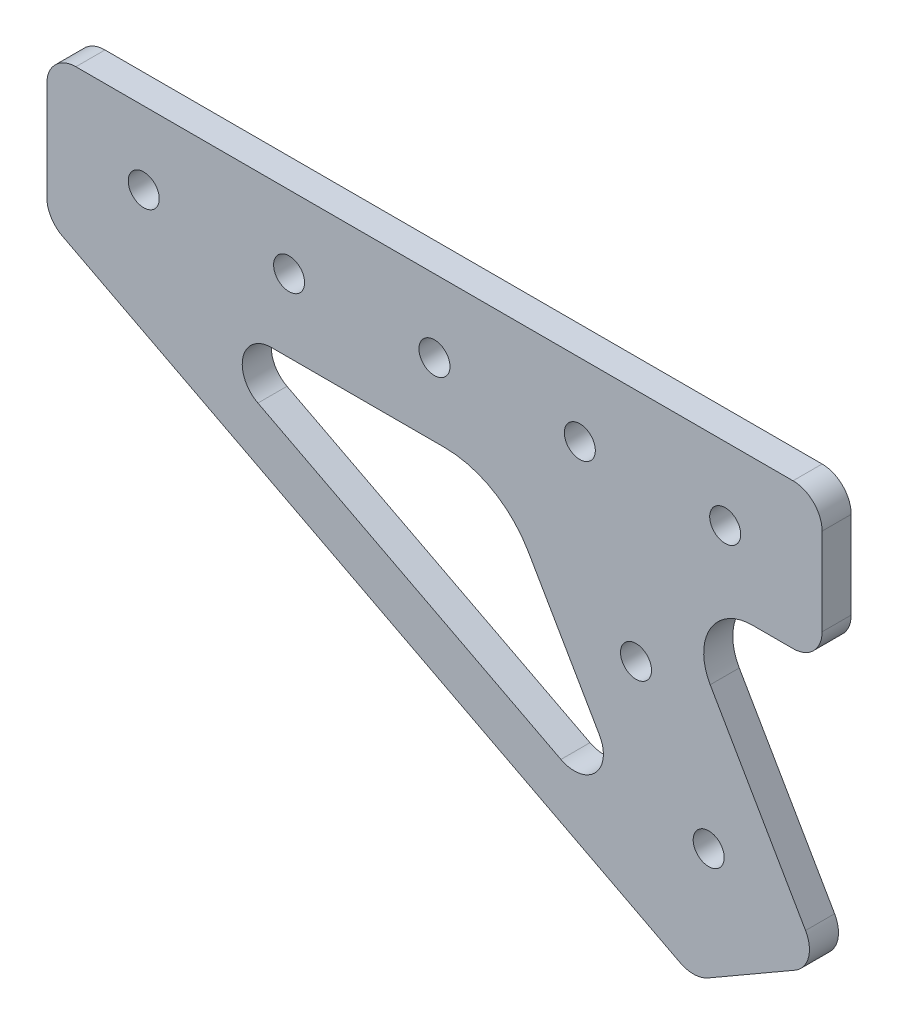
ISO-10303-21;
HEADER;
FILE_DESCRIPTION(('STEP AP214'),'2;1');
FILE_NAME('part.step','',(''),(''),'','','');
FILE_SCHEMA(('AUTOMOTIVE_DESIGN { 1 0 10303 214 1 1 1 1 }'));
ENDSEC;
DATA;
#1=APPLICATION_CONTEXT('core data for automotive mechanical design processes');
#2=APPLICATION_PROTOCOL_DEFINITION('international standard','automotive_design',2000,#1);
#3=PRODUCT_CONTEXT('',#1,'mechanical');
#4=PRODUCT('Part','Part','',(#3));
#5=PRODUCT_RELATED_PRODUCT_CATEGORY('part','',(#4));
#6=PRODUCT_DEFINITION_FORMATION('','',#4);
#7=PRODUCT_DEFINITION_CONTEXT('part definition',#1,'design');
#8=PRODUCT_DEFINITION('design','',#6,#7);
#9=PRODUCT_DEFINITION_SHAPE('','',#8);
#10=(LENGTH_UNIT() NAMED_UNIT(*) SI_UNIT(.MILLI.,.METRE.));
#11=(NAMED_UNIT(*) PLANE_ANGLE_UNIT() SI_UNIT($,.RADIAN.));
#12=(NAMED_UNIT(*) SI_UNIT($,.STERADIAN.) SOLID_ANGLE_UNIT());
#13=UNCERTAINTY_MEASURE_WITH_UNIT(LENGTH_MEASURE(1.E-05),#10,'distance_accuracy_value','');
#14=(GEOMETRIC_REPRESENTATION_CONTEXT(3) GLOBAL_UNCERTAINTY_ASSIGNED_CONTEXT((#13)) GLOBAL_UNIT_ASSIGNED_CONTEXT((#10,
#11,#12)) REPRESENTATION_CONTEXT('',''));
#15=CARTESIAN_POINT('',(0.,0.,0.));
#16=DIRECTION('',(0.,0.,1.));
#17=DIRECTION('',(1.,0.,0.));
#18=AXIS2_PLACEMENT_3D('',#15,#16,#17);
#19=CARTESIAN_POINT('',(0.,0.,3.));
#20=DIRECTION('',(0.,0.,-1.));
#21=DIRECTION('',(-1.,0.,0.));
#22=AXIS2_PLACEMENT_3D('',#19,#20,#21);
#23=PLANE('',#22);
#24=CARTESIAN_POINT('',(-11.7032905771331,-37.2307621135331,3.));
#25=DIRECTION('',(0.,0.,1.));
#26=DIRECTION('',(1.,0.,0.));
#27=AXIS2_PLACEMENT_3D('',#24,#25,#26);
#28=CIRCLE('',#27,1.6);
#29=CARTESIAN_POINT('',(-10.1032905771331,-37.2307621135331,3.));
#30=VERTEX_POINT('',#29);
#31=EDGE_CURVE('E321',#30,#30,#28,.T.);
#32=ORIENTED_EDGE('',*,*,#31,.F.);
#33=EDGE_LOOP('',(#32));
#34=FACE_BOUND('',#33,.T.);
#35=CARTESIAN_POINT('',(-19.2032905771331,-24.2403810567665,3.));
#36=DIRECTION('',(0.,0.,1.));
#37=DIRECTION('',(1.,0.,0.));
#38=AXIS2_PLACEMENT_3D('',#35,#36,#37);
#39=CIRCLE('',#38,1.6);
#40=CARTESIAN_POINT('',(-17.6032905771331,-24.2403810567665,3.));
#41=VERTEX_POINT('',#40);
#42=EDGE_CURVE('E663',#41,#41,#39,.T.);
#43=ORIENTED_EDGE('',*,*,#42,.F.);
#44=EDGE_LOOP('',(#43));
#45=FACE_BOUND('',#44,.T.);
#46=CARTESIAN_POINT('',(-9.99999999999979,-7.5,3.));
#47=DIRECTION('',(0.,0.,1.));
#48=DIRECTION('',(1.,0.,0.));
#49=AXIS2_PLACEMENT_3D('',#46,#47,#48);
#50=CIRCLE('',#49,1.6);
#51=CARTESIAN_POINT('',(-8.39999999999979,-7.5,3.));
#52=VERTEX_POINT('',#51);
#53=EDGE_CURVE('E667',#52,#52,#50,.T.);
#54=ORIENTED_EDGE('',*,*,#53,.F.);
#55=EDGE_LOOP('',(#54));
#56=FACE_BOUND('',#55,.T.);
#57=CARTESIAN_POINT('',(-24.9999999999998,-7.5,3.));
#58=DIRECTION('',(0.,0.,1.));
#59=DIRECTION('',(1.,0.,0.));
#60=AXIS2_PLACEMENT_3D('',#57,#58,#59);
#61=CIRCLE('',#60,1.6);
#62=CARTESIAN_POINT('',(-23.3999999999998,-7.5,3.));
#63=VERTEX_POINT('',#62);
#64=EDGE_CURVE('E675',#63,#63,#61,.T.);
#65=ORIENTED_EDGE('',*,*,#64,.F.);
#66=EDGE_LOOP('',(#65));
#67=FACE_BOUND('',#66,.T.);
#68=CARTESIAN_POINT('',(-39.9999999999998,-7.5,3.));
#69=DIRECTION('',(0.,0.,1.));
#70=DIRECTION('',(1.,0.,0.));
#71=AXIS2_PLACEMENT_3D('',#68,#69,#70);
#72=CIRCLE('',#71,1.6);
#73=CARTESIAN_POINT('',(-38.3999999999998,-7.5,3.));
#74=VERTEX_POINT('',#73);
#75=EDGE_CURVE('E681',#74,#74,#72,.T.);
#76=ORIENTED_EDGE('',*,*,#75,.F.);
#77=EDGE_LOOP('',(#76));
#78=FACE_BOUND('',#77,.T.);
#79=CARTESIAN_POINT('',(-54.9999999999998,-7.5,3.));
#80=DIRECTION('',(0.,0.,1.));
#81=DIRECTION('',(1.,0.,0.));
#82=AXIS2_PLACEMENT_3D('',#79,#80,#81);
#83=CIRCLE('',#82,1.6);
#84=CARTESIAN_POINT('',(-53.3999999999998,-7.5,3.));
#85=VERTEX_POINT('',#84);
#86=EDGE_CURVE('E687',#85,#85,#83,.T.);
#87=ORIENTED_EDGE('',*,*,#86,.F.);
#88=EDGE_LOOP('',(#87));
#89=FACE_BOUND('',#88,.T.);
#90=CARTESIAN_POINT('',(-69.9999999999998,-7.5,3.));
#91=DIRECTION('',(0.,0.,1.));
#92=DIRECTION('',(1.,0.,0.));
#93=AXIS2_PLACEMENT_3D('',#90,#91,#92);
#94=CIRCLE('',#93,1.60000000000001);
#95=CARTESIAN_POINT('',(-68.3999999999998,-7.5,3.));
#96=VERTEX_POINT('',#95);
#97=EDGE_CURVE('E693',#96,#96,#94,.T.);
#98=ORIENTED_EDGE('',*,*,#97,.F.);
#99=EDGE_LOOP('',(#98));
#100=FACE_BOUND('',#99,.T.);
#101=DIRECTION('',(0.,-1.,0.));
#102=VECTOR('',#101,1.);
#103=CARTESIAN_POINT('',(-79.9999999999998,-15.,3.));
#104=LINE('',#103,#102);
#105=CARTESIAN_POINT('',(-80.,-3.00000000000003,3.));
#106=VERTEX_POINT('',#105);
#107=CARTESIAN_POINT('',(-79.9999999999999,-13.1763203887177,3.));
#108=VERTEX_POINT('',#107);
#109=EDGE_CURVE('E328',#106,#108,#104,.T.);
#110=ORIENTED_EDGE('',*,*,#109,.T.);
#111=CARTESIAN_POINT('',(-76.9999999999999,-13.1763203887177,3.));
#112=DIRECTION('',(0.,0.,-1.));
#113=DIRECTION('',(-1.,0.,0.));
#114=AXIS2_PLACEMENT_3D('',#111,#112,#113);
#115=CIRCLE('',#114,3.);
#116=CARTESIAN_POINT('',(-78.3810517703124,-15.8395319852148,3.));
#117=VERTEX_POINT('',#116);
#118=EDGE_CURVE('E255',#108,#117,#115,.F.);
#119=ORIENTED_EDGE('',*,*,#118,.T.);
#120=DIRECTION('',(0.887737198832366,-0.460350590104176,0.));
#121=VECTOR('',#120,1.);
#122=CARTESIAN_POINT('',(-13.1984811055165,-49.6410161513776,3.));
#123=LINE('',#122,#121);
#124=CARTESIAN_POINT('',(-14.6568408769315,-48.8847599279839,3.));
#125=VERTEX_POINT('',#124);
#126=EDGE_CURVE('E331',#117,#125,#123,.T.);
#127=ORIENTED_EDGE('',*,*,#126,.T.);
#128=CARTESIAN_POINT('',(-13.2757891066189,-46.2215483314868,3.));
#129=DIRECTION('',(0.,0.,-1.));
#130=DIRECTION('',(-1.,0.,0.));
#131=AXIS2_PLACEMENT_3D('',#128,#129,#130);
#132=CIRCLE('',#131,3.);
#133=CARTESIAN_POINT('',(-11.7757891066189,-48.8196245428401,3.));
#134=VERTEX_POINT('',#133);
#135=EDGE_CURVE('E253',#125,#134,#132,.F.);
#136=ORIENTED_EDGE('',*,*,#135,.T.);
#137=DIRECTION('',(0.866025403784439,0.5,0.));
#138=VECTOR('',#137,1.);
#139=CARTESIAN_POINT('',(-0.208100048749948,-42.1410161513776,3.));
#140=LINE('',#139,#138);
#141=CARTESIAN_POINT('',(-2.80617626010317,-43.6410161513775,3.));
#142=VERTEX_POINT('',#141);
#143=EDGE_CURVE('E334',#134,#142,#140,.T.);
#144=ORIENTED_EDGE('',*,*,#143,.T.);
#145=CARTESIAN_POINT('',(-4.30617626010317,-41.0429399400242,3.));
#146=DIRECTION('',(0.,0.,-1.));
#147=DIRECTION('',(-1.,0.,0.));
#148=AXIS2_PLACEMENT_3D('',#145,#146,#147);
#149=CIRCLE('',#148,3.);
#150=CARTESIAN_POINT('',(-1.7081000487498,-39.5429399400243,3.));
#151=VERTEX_POINT('',#150);
#152=EDGE_CURVE('E249',#142,#151,#149,.F.);
#153=ORIENTED_EDGE('',*,*,#152,.T.);
#154=DIRECTION('',(-0.499999999999969,0.866025403784456,0.));
#155=VECTOR('',#154,1.);
#156=CARTESIAN_POINT('',(-15.877973029828,-14.9999999999974,3.));
#157=LINE('',#156,#155);
#158=CARTESIAN_POINT('',(-11.5478460109054,-22.4999999999987,3.));
#159=VERTEX_POINT('',#158);
#160=EDGE_CURVE('E337',#151,#159,#157,.T.);
#161=ORIENTED_EDGE('',*,*,#160,.T.);
#162=CARTESIAN_POINT('',(-7.21771899198313,-19.9999999999988,3.));
#163=DIRECTION('',(0.,0.,-1.));
#164=DIRECTION('',(-1.,0.,0.));
#165=AXIS2_PLACEMENT_3D('',#162,#163,#164);
#166=CIRCLE('',#165,5.);
#167=CARTESIAN_POINT('',(-7.2177189919823,-14.9999999999988,3.));
#168=VERTEX_POINT('',#167);
#169=EDGE_CURVE('E187',#159,#168,#166,.T.);
#170=ORIENTED_EDGE('',*,*,#169,.T.);
#171=DIRECTION('',(1.,-1.65300483520301E-13,0.));
#172=VECTOR('',#171,1.);
#173=CARTESIAN_POINT('',(2.21211937656562E-13,-15.,3.));
#174=LINE('',#173,#172);
#175=CARTESIAN_POINT('',(-3.00000000000032,-14.9999999999995,3.));
#176=VERTEX_POINT('',#175);
#177=EDGE_CURVE('E196',#168,#176,#174,.T.);
#178=ORIENTED_EDGE('',*,*,#177,.T.);
#179=CARTESIAN_POINT('',(-2.99999999999982,-11.9999999999995,3.));
#180=DIRECTION('',(0.,0.,-1.));
#181=DIRECTION('',(-1.,0.,0.));
#182=AXIS2_PLACEMENT_3D('',#179,#180,#181);
#183=CIRCLE('',#182,3.);
#184=CARTESIAN_POINT('',(1.76896071317293E-13,-11.9999999999995,3.));
#185=VERTEX_POINT('',#184);
#186=EDGE_CURVE('E245',#176,#185,#183,.F.);
#187=ORIENTED_EDGE('',*,*,#186,.T.);
#188=DIRECTION('',(0.,1.,0.));
#189=VECTOR('',#188,1.);
#190=CARTESIAN_POINT('',(0.,0.,3.));
#191=LINE('',#190,#189);
#192=CARTESIAN_POINT('',(0.,-2.99999999999996,3.));
#193=VERTEX_POINT('',#192);
#194=EDGE_CURVE('E202',#185,#193,#191,.T.);
#195=ORIENTED_EDGE('',*,*,#194,.T.);
#196=CARTESIAN_POINT('',(-2.99999999999996,-3.,3.));
#197=DIRECTION('',(0.,0.,-1.));
#198=DIRECTION('',(-1.,0.,0.));
#199=AXIS2_PLACEMENT_3D('',#196,#197,#198);
#200=CIRCLE('',#199,3.);
#201=CARTESIAN_POINT('',(-2.99999999999996,0.,3.));
#202=VERTEX_POINT('',#201);
#203=EDGE_CURVE('E247',#193,#202,#200,.F.);
#204=ORIENTED_EDGE('',*,*,#203,.T.);
#205=DIRECTION('',(-1.,0.,0.));
#206=VECTOR('',#205,1.);
#207=CARTESIAN_POINT('',(-80.,0.,3.));
#208=LINE('',#207,#206);
#209=CARTESIAN_POINT('',(-77.,0.,3.));
#210=VERTEX_POINT('',#209);
#211=EDGE_CURVE('E206',#202,#210,#208,.T.);
#212=ORIENTED_EDGE('',*,*,#211,.T.);
#213=CARTESIAN_POINT('',(-77.,-3.,3.));
#214=DIRECTION('',(0.,0.,-1.));
#215=DIRECTION('',(-1.,0.,0.));
#216=AXIS2_PLACEMENT_3D('',#213,#214,#215);
#217=CIRCLE('',#216,3.);
#218=EDGE_CURVE('E251',#210,#106,#217,.F.);
#219=ORIENTED_EDGE('',*,*,#218,.T.);
#220=EDGE_LOOP('',(#110,#119,#127,#136,#144,#153,#161,#170,#178,#187,#195,#204,#212,#219));
#221=FACE_BOUND('',#220,.T.);
#222=DIRECTION('',(0.887737198832366,-0.460350590104176,0.));
#223=VECTOR('',#222,1.);
#224=CARTESIAN_POINT('',(-17.8399062206806,-41.6018320323873,3.));
#225=LINE('',#224,#223);
#226=CARTESIAN_POINT('',(-58.2178109149372,-20.6632115964971,3.));
#227=VERTEX_POINT('',#226);
#228=CARTESIAN_POINT('',(-26.9502519364826,-36.8775138086621,3.));
#229=VERTEX_POINT('',#228);
#230=EDGE_CURVE('E297',#227,#229,#225,.T.);
#231=ORIENTED_EDGE('',*,*,#230,.F.);
#232=CARTESIAN_POINT('',(-56.8367591446247,-18.,3.));
#233=DIRECTION('',(0.,0.,-1.));
#234=DIRECTION('',(-1.,0.,0.));
#235=AXIS2_PLACEMENT_3D('',#232,#233,#234);
#236=CIRCLE('',#235,3.);
#237=CARTESIAN_POINT('',(-56.8367591446247,-15.,3.));
#238=VERTEX_POINT('',#237);
#239=EDGE_CURVE('E288',#227,#238,#236,.T.);
#240=ORIENTED_EDGE('',*,*,#239,.T.);
#241=DIRECTION('',(-1.,0.,0.));
#242=VECTOR('',#241,1.);
#243=CARTESIAN_POINT('',(-33.1984811055165,-15.,3.));
#244=LINE('',#243,#242);
#245=CARTESIAN_POINT('',(-38.9719837974128,-15.,3.));
#246=VERTEX_POINT('',#245);
#247=EDGE_CURVE('E294',#246,#238,#244,.T.);
#248=ORIENTED_EDGE('',*,*,#247,.F.);
#249=CARTESIAN_POINT('',(-38.9719837974128,-25.,3.));
#250=DIRECTION('',(0.,0.,-1.));
#251=DIRECTION('',(-1.,0.,0.));
#252=AXIS2_PLACEMENT_3D('',#249,#250,#251);
#253=CIRCLE('',#252,10.);
#254=CARTESIAN_POINT('',(-30.3117297595684,-20.,3.));
#255=VERTEX_POINT('',#254);
#256=EDGE_CURVE('E221',#246,#255,#253,.T.);
#257=ORIENTED_EDGE('',*,*,#256,.T.);
#258=DIRECTION('',(-0.5,0.866025403784439,0.));
#259=VECTOR('',#258,1.);
#260=CARTESIAN_POINT('',(-17.8399062206806,-41.6018320323873,3.));
#261=LINE('',#260,#259);
#262=CARTESIAN_POINT('',(-22.9711239548167,-32.714302212165,3.));
#263=VERTEX_POINT('',#262);
#264=EDGE_CURVE('E307',#263,#255,#261,.T.);
#265=ORIENTED_EDGE('',*,*,#264,.F.);
#266=CARTESIAN_POINT('',(-25.56920016617,-34.214302212165,3.));
#267=DIRECTION('',(0.,0.,-1.));
#268=DIRECTION('',(-1.,0.,0.));
#269=AXIS2_PLACEMENT_3D('',#266,#267,#268);
#270=CIRCLE('',#269,3.);
#271=EDGE_CURVE('E11',#263,#229,#270,.T.);
#272=ORIENTED_EDGE('',*,*,#271,.T.);
#273=EDGE_LOOP('',(#231,#240,#248,#257,#265,#272));
#274=FACE_BOUND('',#273,.T.);
#275=ADVANCED_FACE('F41',(#34,#45,#56,#67,#78,#89,#100,#221,#274),#23,.F.);
#276=CARTESIAN_POINT('',(0.,0.,0.));
#277=DIRECTION('',(0.,0.,-1.));
#278=DIRECTION('',(-1.,0.,0.));
#279=AXIS2_PLACEMENT_3D('',#276,#277,#278);
#280=PLANE('',#279);
#281=CARTESIAN_POINT('',(-11.7032905771331,-37.2307621135331,0.));
#282=DIRECTION('',(0.,0.,1.));
#283=DIRECTION('',(1.,0.,0.));
#284=AXIS2_PLACEMENT_3D('',#281,#282,#283);
#285=CIRCLE('',#284,1.6);
#286=CARTESIAN_POINT('',(-10.1032905771331,-37.2307621135331,0.));
#287=VERTEX_POINT('',#286);
#288=EDGE_CURVE('E317',#287,#287,#285,.T.);
#289=ORIENTED_EDGE('',*,*,#288,.T.);
#290=EDGE_LOOP('',(#289));
#291=FACE_BOUND('',#290,.T.);
#292=CARTESIAN_POINT('',(-19.2032905771331,-24.2403810567665,0.));
#293=DIRECTION('',(0.,0.,1.));
#294=DIRECTION('',(1.,0.,0.));
#295=AXIS2_PLACEMENT_3D('',#292,#293,#294);
#296=CIRCLE('',#295,1.6);
#297=CARTESIAN_POINT('',(-17.6032905771331,-24.2403810567665,0.));
#298=VERTEX_POINT('',#297);
#299=EDGE_CURVE('E660',#298,#298,#296,.T.);
#300=ORIENTED_EDGE('',*,*,#299,.T.);
#301=EDGE_LOOP('',(#300));
#302=FACE_BOUND('',#301,.T.);
#303=CARTESIAN_POINT('',(-9.99999999999979,-7.5,0.));
#304=DIRECTION('',(0.,0.,1.));
#305=DIRECTION('',(1.,0.,0.));
#306=AXIS2_PLACEMENT_3D('',#303,#304,#305);
#307=CIRCLE('',#306,1.6);
#308=CARTESIAN_POINT('',(-8.39999999999979,-7.5,0.));
#309=VERTEX_POINT('',#308);
#310=EDGE_CURVE('E672',#309,#309,#307,.T.);
#311=ORIENTED_EDGE('',*,*,#310,.T.);
#312=EDGE_LOOP('',(#311));
#313=FACE_BOUND('',#312,.T.);
#314=CARTESIAN_POINT('',(-24.9999999999998,-7.5,0.));
#315=DIRECTION('',(0.,0.,1.));
#316=DIRECTION('',(1.,0.,0.));
#317=AXIS2_PLACEMENT_3D('',#314,#315,#316);
#318=CIRCLE('',#317,1.6);
#319=CARTESIAN_POINT('',(-23.3999999999998,-7.5,0.));
#320=VERTEX_POINT('',#319);
#321=EDGE_CURVE('E678',#320,#320,#318,.T.);
#322=ORIENTED_EDGE('',*,*,#321,.T.);
#323=EDGE_LOOP('',(#322));
#324=FACE_BOUND('',#323,.T.);
#325=CARTESIAN_POINT('',(-39.9999999999998,-7.5,0.));
#326=DIRECTION('',(0.,0.,1.));
#327=DIRECTION('',(1.,0.,0.));
#328=AXIS2_PLACEMENT_3D('',#325,#326,#327);
#329=CIRCLE('',#328,1.6);
#330=CARTESIAN_POINT('',(-38.3999999999998,-7.5,0.));
#331=VERTEX_POINT('',#330);
#332=EDGE_CURVE('E684',#331,#331,#329,.T.);
#333=ORIENTED_EDGE('',*,*,#332,.T.);
#334=EDGE_LOOP('',(#333));
#335=FACE_BOUND('',#334,.T.);
#336=CARTESIAN_POINT('',(-54.9999999999998,-7.5,0.));
#337=DIRECTION('',(0.,0.,1.));
#338=DIRECTION('',(1.,0.,0.));
#339=AXIS2_PLACEMENT_3D('',#336,#337,#338);
#340=CIRCLE('',#339,1.6);
#341=CARTESIAN_POINT('',(-53.3999999999998,-7.5,0.));
#342=VERTEX_POINT('',#341);
#343=EDGE_CURVE('E690',#342,#342,#340,.T.);
#344=ORIENTED_EDGE('',*,*,#343,.T.);
#345=EDGE_LOOP('',(#344));
#346=FACE_BOUND('',#345,.T.);
#347=CARTESIAN_POINT('',(-69.9999999999998,-7.5,0.));
#348=DIRECTION('',(0.,0.,1.));
#349=DIRECTION('',(1.,0.,0.));
#350=AXIS2_PLACEMENT_3D('',#347,#348,#349);
#351=CIRCLE('',#350,1.60000000000001);
#352=CARTESIAN_POINT('',(-68.3999999999998,-7.5,0.));
#353=VERTEX_POINT('',#352);
#354=EDGE_CURVE('E696',#353,#353,#351,.T.);
#355=ORIENTED_EDGE('',*,*,#354,.T.);
#356=EDGE_LOOP('',(#355));
#357=FACE_BOUND('',#356,.T.);
#358=DIRECTION('',(0.887737198832366,-0.460350590104176,0.));
#359=VECTOR('',#358,1.);
#360=CARTESIAN_POINT('',(-13.1984811055165,-49.6410161513776,0.));
#361=LINE('',#360,#359);
#362=CARTESIAN_POINT('',(-78.3810517703124,-15.8395319852148,0.));
#363=VERTEX_POINT('',#362);
#364=CARTESIAN_POINT('',(-14.6568408769315,-48.8847599279839,0.));
#365=VERTEX_POINT('',#364);
#366=EDGE_CURVE('E348',#363,#365,#361,.T.);
#367=ORIENTED_EDGE('',*,*,#366,.F.);
#368=CARTESIAN_POINT('',(-76.9999999999999,-13.1763203887177,0.));
#369=DIRECTION('',(0.,0.,-1.));
#370=DIRECTION('',(-1.,0.,0.));
#371=AXIS2_PLACEMENT_3D('',#368,#369,#370);
#372=CIRCLE('',#371,3.);
#373=CARTESIAN_POINT('',(-79.9999999999999,-13.1763203887177,0.));
#374=VERTEX_POINT('',#373);
#375=EDGE_CURVE('E238',#363,#374,#372,.T.);
#376=ORIENTED_EDGE('',*,*,#375,.T.);
#377=DIRECTION('',(0.,-1.,0.));
#378=VECTOR('',#377,1.);
#379=CARTESIAN_POINT('',(-79.9999999999998,-15.,0.));
#380=LINE('',#379,#378);
#381=CARTESIAN_POINT('',(-80.,-3.00000000000003,0.));
#382=VERTEX_POINT('',#381);
#383=EDGE_CURVE('E345',#382,#374,#380,.T.);
#384=ORIENTED_EDGE('',*,*,#383,.F.);
#385=CARTESIAN_POINT('',(-77.,-3.,0.));
#386=DIRECTION('',(0.,0.,-1.));
#387=DIRECTION('',(-1.,0.,0.));
#388=AXIS2_PLACEMENT_3D('',#385,#386,#387);
#389=CIRCLE('',#388,3.);
#390=CARTESIAN_POINT('',(-77.,0.,0.));
#391=VERTEX_POINT('',#390);
#392=EDGE_CURVE('E234',#382,#391,#389,.T.);
#393=ORIENTED_EDGE('',*,*,#392,.T.);
#394=DIRECTION('',(-1.,0.,0.));
#395=VECTOR('',#394,1.);
#396=CARTESIAN_POINT('',(-80.,0.,0.));
#397=LINE('',#396,#395);
#398=CARTESIAN_POINT('',(-2.99999999999996,0.,0.));
#399=VERTEX_POINT('',#398);
#400=EDGE_CURVE('E342',#399,#391,#397,.T.);
#401=ORIENTED_EDGE('',*,*,#400,.F.);
#402=CARTESIAN_POINT('',(-2.99999999999996,-3.,0.));
#403=DIRECTION('',(0.,0.,-1.));
#404=DIRECTION('',(-1.,0.,0.));
#405=AXIS2_PLACEMENT_3D('',#402,#403,#404);
#406=CIRCLE('',#405,3.);
#407=CARTESIAN_POINT('',(0.,-2.99999999999996,0.));
#408=VERTEX_POINT('',#407);
#409=EDGE_CURVE('E230',#399,#408,#406,.T.);
#410=ORIENTED_EDGE('',*,*,#409,.T.);
#411=DIRECTION('',(0.,1.,0.));
#412=VECTOR('',#411,1.);
#413=CARTESIAN_POINT('',(0.,0.,0.));
#414=LINE('',#413,#412);
#415=CARTESIAN_POINT('',(1.76896071317293E-13,-11.9999999999995,0.));
#416=VERTEX_POINT('',#415);
#417=EDGE_CURVE('E306',#416,#408,#414,.T.);
#418=ORIENTED_EDGE('',*,*,#417,.F.);
#419=CARTESIAN_POINT('',(-2.99999999999982,-11.9999999999995,0.));
#420=DIRECTION('',(0.,0.,-1.));
#421=DIRECTION('',(-1.,0.,0.));
#422=AXIS2_PLACEMENT_3D('',#419,#420,#421);
#423=CIRCLE('',#422,3.);
#424=CARTESIAN_POINT('',(-3.00000000000032,-14.9999999999995,0.));
#425=VERTEX_POINT('',#424);
#426=EDGE_CURVE('E201',#416,#425,#423,.T.);
#427=ORIENTED_EDGE('',*,*,#426,.T.);
#428=DIRECTION('',(1.,-1.65300483520301E-13,0.));
#429=VECTOR('',#428,1.);
#430=CARTESIAN_POINT('',(2.21211937656562E-13,-15.,0.));
#431=LINE('',#430,#429);
#432=CARTESIAN_POINT('',(-7.2177189919823,-14.9999999999988,0.));
#433=VERTEX_POINT('',#432);
#434=EDGE_CURVE('E193',#433,#425,#431,.T.);
#435=ORIENTED_EDGE('',*,*,#434,.F.);
#436=CARTESIAN_POINT('',(-7.21771899198313,-19.9999999999988,0.));
#437=DIRECTION('',(0.,0.,-1.));
#438=DIRECTION('',(-1.,0.,0.));
#439=AXIS2_PLACEMENT_3D('',#436,#437,#438);
#440=CIRCLE('',#439,5.);
#441=CARTESIAN_POINT('',(-11.5478460109054,-22.4999999999987,0.));
#442=VERTEX_POINT('',#441);
#443=EDGE_CURVE('E177',#433,#442,#440,.F.);
#444=ORIENTED_EDGE('',*,*,#443,.T.);
#445=DIRECTION('',(-0.499999999999969,0.866025403784456,0.));
#446=VECTOR('',#445,1.);
#447=CARTESIAN_POINT('',(-15.877973029828,-14.9999999999974,0.));
#448=LINE('',#447,#446);
#449=CARTESIAN_POINT('',(-1.7081000487498,-39.5429399400243,0.));
#450=VERTEX_POINT('',#449);
#451=EDGE_CURVE('E203',#450,#442,#448,.T.);
#452=ORIENTED_EDGE('',*,*,#451,.F.);
#453=CARTESIAN_POINT('',(-4.30617626010317,-41.0429399400242,0.));
#454=DIRECTION('',(0.,0.,-1.));
#455=DIRECTION('',(-1.,0.,0.));
#456=AXIS2_PLACEMENT_3D('',#453,#454,#455);
#457=CIRCLE('',#456,3.);
#458=CARTESIAN_POINT('',(-2.80617626010317,-43.6410161513775,0.));
#459=VERTEX_POINT('',#458);
#460=EDGE_CURVE('E232',#450,#459,#457,.T.);
#461=ORIENTED_EDGE('',*,*,#460,.T.);
#462=DIRECTION('',(0.866025403784439,0.5,0.));
#463=VECTOR('',#462,1.);
#464=CARTESIAN_POINT('',(-0.208100048749948,-42.1410161513776,0.));
#465=LINE('',#464,#463);
#466=CARTESIAN_POINT('',(-11.7757891066189,-48.8196245428401,0.));
#467=VERTEX_POINT('',#466);
#468=EDGE_CURVE('E208',#467,#459,#465,.T.);
#469=ORIENTED_EDGE('',*,*,#468,.F.);
#470=CARTESIAN_POINT('',(-13.2757891066189,-46.2215483314868,0.));
#471=DIRECTION('',(0.,0.,-1.));
#472=DIRECTION('',(-1.,0.,0.));
#473=AXIS2_PLACEMENT_3D('',#470,#471,#472);
#474=CIRCLE('',#473,3.);
#475=EDGE_CURVE('E236',#467,#365,#474,.T.);
#476=ORIENTED_EDGE('',*,*,#475,.T.);
#477=EDGE_LOOP('',(#367,#376,#384,#393,#401,#410,#418,#427,#435,#444,#452,#461,#469,#476));
#478=FACE_BOUND('',#477,.T.);
#479=DIRECTION('',(0.887737198832366,-0.460350590104176,0.));
#480=VECTOR('',#479,1.);
#481=CARTESIAN_POINT('',(-17.8399062206806,-41.6018320323873,0.));
#482=LINE('',#481,#480);
#483=CARTESIAN_POINT('',(-58.2178109149372,-20.6632115964971,0.));
#484=VERTEX_POINT('',#483);
#485=CARTESIAN_POINT('',(-26.9502519364826,-36.8775138086621,0.));
#486=VERTEX_POINT('',#485);
#487=EDGE_CURVE('E311',#484,#486,#482,.T.);
#488=ORIENTED_EDGE('',*,*,#487,.T.);
#489=CARTESIAN_POINT('',(-25.56920016617,-34.214302212165,0.));
#490=DIRECTION('',(0.,0.,-1.));
#491=DIRECTION('',(-1.,0.,0.));
#492=AXIS2_PLACEMENT_3D('',#489,#490,#491);
#493=CIRCLE('',#492,3.);
#494=CARTESIAN_POINT('',(-22.9711239548167,-32.714302212165,0.));
#495=VERTEX_POINT('',#494);
#496=EDGE_CURVE('E49',#486,#495,#493,.F.);
#497=ORIENTED_EDGE('',*,*,#496,.T.);
#498=DIRECTION('',(-0.5,0.866025403784439,0.));
#499=VECTOR('',#498,1.);
#500=CARTESIAN_POINT('',(-17.8399062206806,-41.6018320323873,0.));
#501=LINE('',#500,#499);
#502=CARTESIAN_POINT('',(-30.3117297595684,-20.,0.));
#503=VERTEX_POINT('',#502);
#504=EDGE_CURVE('E316',#495,#503,#501,.T.);
#505=ORIENTED_EDGE('',*,*,#504,.T.);
#506=CARTESIAN_POINT('',(-38.9719837974128,-25.,0.));
#507=DIRECTION('',(0.,0.,-1.));
#508=DIRECTION('',(-1.,0.,0.));
#509=AXIS2_PLACEMENT_3D('',#506,#507,#508);
#510=CIRCLE('',#509,10.);
#511=CARTESIAN_POINT('',(-38.9719837974128,-15.,0.));
#512=VERTEX_POINT('',#511);
#513=EDGE_CURVE('E219',#503,#512,#510,.F.);
#514=ORIENTED_EDGE('',*,*,#513,.T.);
#515=DIRECTION('',(-1.,0.,0.));
#516=VECTOR('',#515,1.);
#517=CARTESIAN_POINT('',(-33.1984811055165,-15.,0.));
#518=LINE('',#517,#516);
#519=CARTESIAN_POINT('',(-56.8367591446247,-15.,0.));
#520=VERTEX_POINT('',#519);
#521=EDGE_CURVE('E312',#512,#520,#518,.T.);
#522=ORIENTED_EDGE('',*,*,#521,.T.);
#523=CARTESIAN_POINT('',(-56.8367591446247,-18.,0.));
#524=DIRECTION('',(0.,0.,-1.));
#525=DIRECTION('',(-1.,0.,0.));
#526=AXIS2_PLACEMENT_3D('',#523,#524,#525);
#527=CIRCLE('',#526,3.);
#528=EDGE_CURVE('E286',#520,#484,#527,.F.);
#529=ORIENTED_EDGE('',*,*,#528,.T.);
#530=EDGE_LOOP('',(#488,#497,#505,#514,#522,#529));
#531=FACE_BOUND('',#530,.T.);
#532=ADVANCED_FACE('F199',(#291,#302,#313,#324,#335,#346,#357,#478,#531),#280,.T.);
#533=CARTESIAN_POINT('',(0.,0.,3.));
#534=DIRECTION('',(-1.,0.,0.));
#535=DIRECTION('',(0.,-1.,0.));
#536=AXIS2_PLACEMENT_3D('',#533,#534,#535);
#537=PLANE('',#536);
#538=ORIENTED_EDGE('',*,*,#417,.T.);
#539=DIRECTION('',(0.,0.,-1.));
#540=VECTOR('',#539,1.);
#541=CARTESIAN_POINT('',(0.,-2.99999999999996,3.));
#542=LINE('',#541,#540);
#543=EDGE_CURVE('E273',#408,#193,#542,.F.);
#544=ORIENTED_EDGE('',*,*,#543,.T.);
#545=ORIENTED_EDGE('',*,*,#194,.F.);
#546=DIRECTION('',(0.,0.,-1.));
#547=VECTOR('',#546,1.);
#548=CARTESIAN_POINT('',(1.76896071317293E-13,-11.9999999999995,3.));
#549=LINE('',#548,#547);
#550=EDGE_CURVE('E270',#185,#416,#549,.T.);
#551=ORIENTED_EDGE('',*,*,#550,.T.);
#552=EDGE_LOOP('',(#538,#544,#545,#551));
#553=FACE_BOUND('',#552,.T.);
#554=ADVANCED_FACE('F371',(#553),#537,.F.);
#555=CARTESIAN_POINT('',(-80.,0.,3.));
#556=DIRECTION('',(0.,-1.,0.));
#557=DIRECTION('',(0.,0.,-1.));
#558=AXIS2_PLACEMENT_3D('',#555,#556,#557);
#559=PLANE('',#558);
#560=ORIENTED_EDGE('',*,*,#400,.T.);
#561=DIRECTION('',(0.,0.,-1.));
#562=VECTOR('',#561,1.);
#563=CARTESIAN_POINT('',(-77.,0.,3.));
#564=LINE('',#563,#562);
#565=EDGE_CURVE('E265',#391,#210,#564,.F.);
#566=ORIENTED_EDGE('',*,*,#565,.T.);
#567=ORIENTED_EDGE('',*,*,#211,.F.);
#568=DIRECTION('',(0.,0.,-1.));
#569=VECTOR('',#568,1.);
#570=CARTESIAN_POINT('',(-2.99999999999996,0.,3.));
#571=LINE('',#570,#569);
#572=EDGE_CURVE('E262',#202,#399,#571,.T.);
#573=ORIENTED_EDGE('',*,*,#572,.T.);
#574=EDGE_LOOP('',(#560,#566,#567,#573));
#575=FACE_BOUND('',#574,.T.);
#576=ADVANCED_FACE('F380',(#575),#559,.F.);
#577=CARTESIAN_POINT('',(-79.9999999999998,-15.,3.));
#578=DIRECTION('',(1.,0.,0.));
#579=DIRECTION('',(0.,1.,0.));
#580=AXIS2_PLACEMENT_3D('',#577,#578,#579);
#581=PLANE('',#580);
#582=ORIENTED_EDGE('',*,*,#383,.T.);
#583=DIRECTION('',(0.,0.,-1.));
#584=VECTOR('',#583,1.);
#585=CARTESIAN_POINT('',(-79.9999999999999,-13.1763203887177,3.));
#586=LINE('',#585,#584);
#587=EDGE_CURVE('E243',#374,#108,#586,.F.);
#588=ORIENTED_EDGE('',*,*,#587,.T.);
#589=ORIENTED_EDGE('',*,*,#109,.F.);
#590=DIRECTION('',(0.,0.,-1.));
#591=VECTOR('',#590,1.);
#592=CARTESIAN_POINT('',(-80.,-3.00000000000003,3.));
#593=LINE('',#592,#591);
#594=EDGE_CURVE('E240',#106,#382,#593,.T.);
#595=ORIENTED_EDGE('',*,*,#594,.T.);
#596=EDGE_LOOP('',(#582,#588,#589,#595));
#597=FACE_BOUND('',#596,.T.);
#598=ADVANCED_FACE('F389',(#597),#581,.F.);
#599=CARTESIAN_POINT('',(-13.1984811055165,-49.6410161513776,3.));
#600=DIRECTION('',(0.460350590104176,0.887737198832366,0.));
#601=DIRECTION('',(-0.887737198832366,0.460350590104176,0.));
#602=AXIS2_PLACEMENT_3D('',#599,#600,#601);
#603=PLANE('',#602);
#604=ORIENTED_EDGE('',*,*,#126,.F.);
#605=DIRECTION('',(0.,0.,-1.));
#606=VECTOR('',#605,1.);
#607=CARTESIAN_POINT('',(-78.3810517703124,-15.8395319852148,3.));
#608=LINE('',#607,#606);
#609=EDGE_CURVE('E226',#117,#363,#608,.T.);
#610=ORIENTED_EDGE('',*,*,#609,.T.);
#611=ORIENTED_EDGE('',*,*,#366,.T.);
#612=DIRECTION('',(0.,0.,-1.));
#613=VECTOR('',#612,1.);
#614=CARTESIAN_POINT('',(-14.6568408769315,-48.8847599279839,3.));
#615=LINE('',#614,#613);
#616=EDGE_CURVE('E224',#365,#125,#615,.F.);
#617=ORIENTED_EDGE('',*,*,#616,.T.);
#618=EDGE_LOOP('',(#604,#610,#611,#617));
#619=FACE_BOUND('',#618,.T.);
#620=ADVANCED_FACE('F397',(#619),#603,.F.);
#621=CARTESIAN_POINT('',(-0.208100048749948,-42.1410161513776,3.));
#622=DIRECTION('',(-0.5,0.866025403784439,0.));
#623=DIRECTION('',(-0.866025403784439,-0.5,0.));
#624=AXIS2_PLACEMENT_3D('',#621,#622,#623);
#625=PLANE('',#624);
#626=ORIENTED_EDGE('',*,*,#143,.F.);
#627=DIRECTION('',(0.,0.,-1.));
#628=VECTOR('',#627,1.);
#629=CARTESIAN_POINT('',(-11.7757891066189,-48.8196245428401,3.));
#630=LINE('',#629,#628);
#631=EDGE_CURVE('E259',#134,#467,#630,.T.);
#632=ORIENTED_EDGE('',*,*,#631,.T.);
#633=ORIENTED_EDGE('',*,*,#468,.T.);
#634=DIRECTION('',(0.,0.,-1.));
#635=VECTOR('',#634,1.);
#636=CARTESIAN_POINT('',(-2.80617626010317,-43.6410161513775,3.));
#637=LINE('',#636,#635);
#638=EDGE_CURVE('E257',#459,#142,#637,.F.);
#639=ORIENTED_EDGE('',*,*,#638,.T.);
#640=EDGE_LOOP('',(#626,#632,#633,#639));
#641=FACE_BOUND('',#640,.T.);
#642=ADVANCED_FACE('F355',(#641),#625,.F.);
#643=CARTESIAN_POINT('',(-15.877973029828,-14.9999999999974,3.));
#644=DIRECTION('',(-0.866025403784456,-0.499999999999969,0.));
#645=DIRECTION('',(0.499999999999969,-0.866025403784457,0.));
#646=AXIS2_PLACEMENT_3D('',#643,#644,#645);
#647=PLANE('',#646);
#648=ORIENTED_EDGE('',*,*,#160,.F.);
#649=DIRECTION('',(0.,0.,-1.));
#650=VECTOR('',#649,1.);
#651=CARTESIAN_POINT('',(-1.7081000487498,-39.5429399400243,3.));
#652=LINE('',#651,#650);
#653=EDGE_CURVE('E267',#151,#450,#652,.T.);
#654=ORIENTED_EDGE('',*,*,#653,.T.);
#655=ORIENTED_EDGE('',*,*,#451,.T.);
#656=DIRECTION('',(0.,0.,-1.));
#657=VECTOR('',#656,1.);
#658=CARTESIAN_POINT('',(-11.5478460109054,-22.4999999999987,3.));
#659=LINE('',#658,#657);
#660=EDGE_CURVE('E183',#442,#159,#659,.F.);
#661=ORIENTED_EDGE('',*,*,#660,.T.);
#662=EDGE_LOOP('',(#648,#654,#655,#661));
#663=FACE_BOUND('',#662,.T.);
#664=ADVANCED_FACE('F364',(#663),#647,.F.);
#665=CARTESIAN_POINT('',(2.21211937656562E-13,-15.,3.));
#666=DIRECTION('',(1.65300483520301E-13,1.,0.));
#667=DIRECTION('',(-1.,1.65300483520301E-13,0.));
#668=AXIS2_PLACEMENT_3D('',#665,#666,#667);
#669=PLANE('',#668);
#670=ORIENTED_EDGE('',*,*,#434,.T.);
#671=DIRECTION('',(0.,0.,-1.));
#672=VECTOR('',#671,1.);
#673=CARTESIAN_POINT('',(-3.00000000000032,-14.9999999999995,3.));
#674=LINE('',#673,#672);
#675=EDGE_CURVE('E275',#425,#176,#674,.F.);
#676=ORIENTED_EDGE('',*,*,#675,.T.);
#677=ORIENTED_EDGE('',*,*,#177,.F.);
#678=DIRECTION('',(0.,0.,-1.));
#679=VECTOR('',#678,1.);
#680=CARTESIAN_POINT('',(-7.2177189919823,-14.9999999999988,0.));
#681=LINE('',#680,#679);
#682=EDGE_CURVE('E181',#168,#433,#681,.T.);
#683=ORIENTED_EDGE('',*,*,#682,.T.);
#684=EDGE_LOOP('',(#670,#676,#677,#683));
#685=FACE_BOUND('',#684,.T.);
#686=ADVANCED_FACE('F192',(#685),#669,.F.);
#687=CARTESIAN_POINT('',(-17.8399062206806,-41.6018320323873,3.));
#688=DIRECTION('',(0.460350590104176,0.887737198832366,0.));
#689=DIRECTION('',(-0.887737198832366,0.460350590104176,0.));
#690=AXIS2_PLACEMENT_3D('',#687,#688,#689);
#691=PLANE('',#690);
#692=ORIENTED_EDGE('',*,*,#487,.F.);
#693=DIRECTION('',(0.,0.,-1.));
#694=VECTOR('',#693,1.);
#695=CARTESIAN_POINT('',(-58.2178109149372,-20.6632115964971,3.));
#696=LINE('',#695,#694);
#697=EDGE_CURVE('E283',#484,#227,#696,.F.);
#698=ORIENTED_EDGE('',*,*,#697,.T.);
#699=ORIENTED_EDGE('',*,*,#230,.T.);
#700=DIRECTION('',(0.,0.,-1.));
#701=VECTOR('',#700,1.);
#702=CARTESIAN_POINT('',(-26.9502519364826,-36.8775138086621,0.));
#703=LINE('',#702,#701);
#704=EDGE_CURVE('E280',#229,#486,#703,.T.);
#705=ORIENTED_EDGE('',*,*,#704,.T.);
#706=EDGE_LOOP('',(#692,#698,#699,#705));
#707=FACE_BOUND('',#706,.T.);
#708=ADVANCED_FACE('F314',(#707),#691,.T.);
#709=CARTESIAN_POINT('',(-17.8399062206806,-41.6018320323873,3.));
#710=DIRECTION('',(-0.866025403784439,-0.5,0.));
#711=DIRECTION('',(0.5,-0.866025403784439,0.));
#712=AXIS2_PLACEMENT_3D('',#709,#710,#711);
#713=PLANE('',#712);
#714=ORIENTED_EDGE('',*,*,#504,.F.);
#715=DIRECTION('',(0.,0.,-1.));
#716=VECTOR('',#715,1.);
#717=CARTESIAN_POINT('',(-22.9711239548167,-32.714302212165,3.));
#718=LINE('',#717,#716);
#719=EDGE_CURVE('E62',#495,#263,#718,.F.);
#720=ORIENTED_EDGE('',*,*,#719,.T.);
#721=ORIENTED_EDGE('',*,*,#264,.T.);
#722=DIRECTION('',(0.,0.,-1.));
#723=VECTOR('',#722,1.);
#724=CARTESIAN_POINT('',(-30.3117297595684,-20.,0.));
#725=LINE('',#724,#723);
#726=EDGE_CURVE('E214',#255,#503,#725,.T.);
#727=ORIENTED_EDGE('',*,*,#726,.T.);
#728=EDGE_LOOP('',(#714,#720,#721,#727));
#729=FACE_BOUND('',#728,.T.);
#730=ADVANCED_FACE('F585',(#729),#713,.T.);
#731=CARTESIAN_POINT('',(-33.1984811055165,-15.,3.));
#732=DIRECTION('',(0.,-1.,0.));
#733=DIRECTION('',(1.,0.,0.));
#734=AXIS2_PLACEMENT_3D('',#731,#732,#733);
#735=PLANE('',#734);
#736=ORIENTED_EDGE('',*,*,#247,.T.);
#737=DIRECTION('',(0.,0.,-1.));
#738=VECTOR('',#737,1.);
#739=CARTESIAN_POINT('',(-56.8367591446247,-15.,0.));
#740=LINE('',#739,#738);
#741=EDGE_CURVE('E277',#238,#520,#740,.T.);
#742=ORIENTED_EDGE('',*,*,#741,.T.);
#743=ORIENTED_EDGE('',*,*,#521,.F.);
#744=DIRECTION('',(0.,0.,-1.));
#745=VECTOR('',#744,1.);
#746=CARTESIAN_POINT('',(-38.9719837974128,-15.,3.));
#747=LINE('',#746,#745);
#748=EDGE_CURVE('E217',#512,#246,#747,.F.);
#749=ORIENTED_EDGE('',*,*,#748,.T.);
#750=EDGE_LOOP('',(#736,#742,#743,#749));
#751=FACE_BOUND('',#750,.T.);
#752=ADVANCED_FACE('F302',(#751),#735,.T.);
#753=CARTESIAN_POINT('',(-7.21771899198313,-19.9999999999988,3.));
#754=DIRECTION('',(0.,0.,1.));
#755=DIRECTION('',(1.,0.,0.));
#756=AXIS2_PLACEMENT_3D('',#753,#754,#755);
#757=CYLINDRICAL_SURFACE('',#756,5.);
#758=ORIENTED_EDGE('',*,*,#169,.F.);
#759=ORIENTED_EDGE('',*,*,#660,.F.);
#760=ORIENTED_EDGE('',*,*,#443,.F.);
#761=ORIENTED_EDGE('',*,*,#682,.F.);
#762=EDGE_LOOP('',(#758,#759,#760,#761));
#763=FACE_BOUND('',#762,.T.);
#764=ADVANCED_FACE('F180',(#763),#757,.F.);
#765=CARTESIAN_POINT('',(-38.9719837974128,-25.,3.));
#766=DIRECTION('',(0.,0.,1.));
#767=DIRECTION('',(1.,0.,0.));
#768=AXIS2_PLACEMENT_3D('',#765,#766,#767);
#769=CYLINDRICAL_SURFACE('',#768,10.);
#770=ORIENTED_EDGE('',*,*,#256,.F.);
#771=ORIENTED_EDGE('',*,*,#748,.F.);
#772=ORIENTED_EDGE('',*,*,#513,.F.);
#773=ORIENTED_EDGE('',*,*,#726,.F.);
#774=EDGE_LOOP('',(#770,#771,#772,#773));
#775=FACE_BOUND('',#774,.T.);
#776=ADVANCED_FACE('F409',(#775),#769,.F.);
#777=CARTESIAN_POINT('',(-76.9999999999999,-13.1763203887177,3.));
#778=DIRECTION('',(0.,0.,-1.));
#779=DIRECTION('',(-1.,0.,0.));
#780=AXIS2_PLACEMENT_3D('',#777,#778,#779);
#781=CYLINDRICAL_SURFACE('',#780,3.);
#782=ORIENTED_EDGE('',*,*,#118,.F.);
#783=ORIENTED_EDGE('',*,*,#587,.F.);
#784=ORIENTED_EDGE('',*,*,#375,.F.);
#785=ORIENTED_EDGE('',*,*,#609,.F.);
#786=EDGE_LOOP('',(#782,#783,#784,#785));
#787=FACE_BOUND('',#786,.T.);
#788=ADVANCED_FACE('F394',(#787),#781,.T.);
#789=CARTESIAN_POINT('',(-13.2757891066189,-46.2215483314868,3.));
#790=DIRECTION('',(0.,0.,-1.));
#791=DIRECTION('',(-1.,0.,0.));
#792=AXIS2_PLACEMENT_3D('',#789,#790,#791);
#793=CYLINDRICAL_SURFACE('',#792,3.);
#794=ORIENTED_EDGE('',*,*,#135,.F.);
#795=ORIENTED_EDGE('',*,*,#616,.F.);
#796=ORIENTED_EDGE('',*,*,#475,.F.);
#797=ORIENTED_EDGE('',*,*,#631,.F.);
#798=EDGE_LOOP('',(#794,#795,#796,#797));
#799=FACE_BOUND('',#798,.T.);
#800=ADVANCED_FACE('F401',(#799),#793,.T.);
#801=CARTESIAN_POINT('',(-77.,-3.,3.));
#802=DIRECTION('',(0.,0.,-1.));
#803=DIRECTION('',(-1.,0.,0.));
#804=AXIS2_PLACEMENT_3D('',#801,#802,#803);
#805=CYLINDRICAL_SURFACE('',#804,3.);
#806=ORIENTED_EDGE('',*,*,#218,.F.);
#807=ORIENTED_EDGE('',*,*,#565,.F.);
#808=ORIENTED_EDGE('',*,*,#392,.F.);
#809=ORIENTED_EDGE('',*,*,#594,.F.);
#810=EDGE_LOOP('',(#806,#807,#808,#809));
#811=FACE_BOUND('',#810,.T.);
#812=ADVANCED_FACE('F386',(#811),#805,.T.);
#813=CARTESIAN_POINT('',(-4.30617626010317,-41.0429399400242,3.));
#814=DIRECTION('',(0.,0.,-1.));
#815=DIRECTION('',(-1.,0.,0.));
#816=AXIS2_PLACEMENT_3D('',#813,#814,#815);
#817=CYLINDRICAL_SURFACE('',#816,3.);
#818=ORIENTED_EDGE('',*,*,#152,.F.);
#819=ORIENTED_EDGE('',*,*,#638,.F.);
#820=ORIENTED_EDGE('',*,*,#460,.F.);
#821=ORIENTED_EDGE('',*,*,#653,.F.);
#822=EDGE_LOOP('',(#818,#819,#820,#821));
#823=FACE_BOUND('',#822,.T.);
#824=ADVANCED_FACE('F359',(#823),#817,.T.);
#825=CARTESIAN_POINT('',(-2.99999999999996,-3.,3.));
#826=DIRECTION('',(0.,0.,-1.));
#827=DIRECTION('',(-1.,0.,0.));
#828=AXIS2_PLACEMENT_3D('',#825,#826,#827);
#829=CYLINDRICAL_SURFACE('',#828,3.);
#830=ORIENTED_EDGE('',*,*,#203,.F.);
#831=ORIENTED_EDGE('',*,*,#543,.F.);
#832=ORIENTED_EDGE('',*,*,#409,.F.);
#833=ORIENTED_EDGE('',*,*,#572,.F.);
#834=EDGE_LOOP('',(#830,#831,#832,#833));
#835=FACE_BOUND('',#834,.T.);
#836=ADVANCED_FACE('F377',(#835),#829,.T.);
#837=CARTESIAN_POINT('',(-2.99999999999982,-11.9999999999995,3.));
#838=DIRECTION('',(0.,0.,-1.));
#839=DIRECTION('',(-1.,0.,0.));
#840=AXIS2_PLACEMENT_3D('',#837,#838,#839);
#841=CYLINDRICAL_SURFACE('',#840,3.);
#842=ORIENTED_EDGE('',*,*,#186,.F.);
#843=ORIENTED_EDGE('',*,*,#675,.F.);
#844=ORIENTED_EDGE('',*,*,#426,.F.);
#845=ORIENTED_EDGE('',*,*,#550,.F.);
#846=EDGE_LOOP('',(#842,#843,#844,#845));
#847=FACE_BOUND('',#846,.T.);
#848=ADVANCED_FACE('F369',(#847),#841,.T.);
#849=CARTESIAN_POINT('',(-69.9999999999998,-7.5,0.));
#850=DIRECTION('',(0.,0.,1.));
#851=DIRECTION('',(1.,0.,0.));
#852=AXIS2_PLACEMENT_3D('',#849,#850,#851);
#853=CYLINDRICAL_SURFACE('',#852,1.60000000000001);
#854=ORIENTED_EDGE('',*,*,#354,.F.);
#855=EDGE_LOOP('',(#854));
#856=FACE_BOUND('',#855,.T.);
#857=ORIENTED_EDGE('',*,*,#97,.T.);
#858=EDGE_LOOP('',(#857));
#859=FACE_BOUND('',#858,.T.);
#860=ADVANCED_FACE('F463',(#856,#859),#853,.F.);
#861=CARTESIAN_POINT('',(-54.9999999999998,-7.5,0.));
#862=DIRECTION('',(0.,0.,1.));
#863=DIRECTION('',(1.,0.,0.));
#864=AXIS2_PLACEMENT_3D('',#861,#862,#863);
#865=CYLINDRICAL_SURFACE('',#864,1.6);
#866=ORIENTED_EDGE('',*,*,#343,.F.);
#867=EDGE_LOOP('',(#866));
#868=FACE_BOUND('',#867,.T.);
#869=ORIENTED_EDGE('',*,*,#86,.T.);
#870=EDGE_LOOP('',(#869));
#871=FACE_BOUND('',#870,.T.);
#872=ADVANCED_FACE('F488',(#868,#871),#865,.F.);
#873=CARTESIAN_POINT('',(-39.9999999999998,-7.5,0.));
#874=DIRECTION('',(0.,0.,1.));
#875=DIRECTION('',(1.,0.,0.));
#876=AXIS2_PLACEMENT_3D('',#873,#874,#875);
#877=CYLINDRICAL_SURFACE('',#876,1.6);
#878=ORIENTED_EDGE('',*,*,#332,.F.);
#879=EDGE_LOOP('',(#878));
#880=FACE_BOUND('',#879,.T.);
#881=ORIENTED_EDGE('',*,*,#75,.T.);
#882=EDGE_LOOP('',(#881));
#883=FACE_BOUND('',#882,.T.);
#884=ADVANCED_FACE('F497',(#880,#883),#877,.F.);
#885=CARTESIAN_POINT('',(-24.9999999999998,-7.5,0.));
#886=DIRECTION('',(0.,0.,1.));
#887=DIRECTION('',(1.,0.,0.));
#888=AXIS2_PLACEMENT_3D('',#885,#886,#887);
#889=CYLINDRICAL_SURFACE('',#888,1.6);
#890=ORIENTED_EDGE('',*,*,#321,.F.);
#891=EDGE_LOOP('',(#890));
#892=FACE_BOUND('',#891,.T.);
#893=ORIENTED_EDGE('',*,*,#64,.T.);
#894=EDGE_LOOP('',(#893));
#895=FACE_BOUND('',#894,.T.);
#896=ADVANCED_FACE('F506',(#892,#895),#889,.F.);
#897=CARTESIAN_POINT('',(-9.99999999999979,-7.5,0.));
#898=DIRECTION('',(0.,0.,1.));
#899=DIRECTION('',(1.,0.,0.));
#900=AXIS2_PLACEMENT_3D('',#897,#898,#899);
#901=CYLINDRICAL_SURFACE('',#900,1.6);
#902=ORIENTED_EDGE('',*,*,#310,.F.);
#903=EDGE_LOOP('',(#902));
#904=FACE_BOUND('',#903,.T.);
#905=ORIENTED_EDGE('',*,*,#53,.T.);
#906=EDGE_LOOP('',(#905));
#907=FACE_BOUND('',#906,.T.);
#908=ADVANCED_FACE('F515',(#904,#907),#901,.F.);
#909=CARTESIAN_POINT('',(-19.2032905771331,-24.2403810567665,0.));
#910=DIRECTION('',(0.,0.,1.));
#911=DIRECTION('',(1.,0.,0.));
#912=AXIS2_PLACEMENT_3D('',#909,#910,#911);
#913=CYLINDRICAL_SURFACE('',#912,1.6);
#914=ORIENTED_EDGE('',*,*,#299,.F.);
#915=EDGE_LOOP('',(#914));
#916=FACE_BOUND('',#915,.T.);
#917=ORIENTED_EDGE('',*,*,#42,.T.);
#918=EDGE_LOOP('',(#917));
#919=FACE_BOUND('',#918,.T.);
#920=ADVANCED_FACE('F457',(#916,#919),#913,.F.);
#921=CARTESIAN_POINT('',(-11.7032905771331,-37.2307621135331,0.));
#922=DIRECTION('',(0.,0.,1.));
#923=DIRECTION('',(1.,0.,0.));
#924=AXIS2_PLACEMENT_3D('',#921,#922,#923);
#925=CYLINDRICAL_SURFACE('',#924,1.6);
#926=ORIENTED_EDGE('',*,*,#288,.F.);
#927=EDGE_LOOP('',(#926));
#928=FACE_BOUND('',#927,.T.);
#929=ORIENTED_EDGE('',*,*,#31,.T.);
#930=EDGE_LOOP('',(#929));
#931=FACE_BOUND('',#930,.T.);
#932=ADVANCED_FACE('F453',(#928,#931),#925,.F.);
#933=CARTESIAN_POINT('',(-56.8367591446247,-18.,3.));
#934=DIRECTION('',(0.,0.,1.));
#935=DIRECTION('',(1.,0.,0.));
#936=AXIS2_PLACEMENT_3D('',#933,#934,#935);
#937=CYLINDRICAL_SURFACE('',#936,3.);
#938=ORIENTED_EDGE('',*,*,#239,.F.);
#939=ORIENTED_EDGE('',*,*,#697,.F.);
#940=ORIENTED_EDGE('',*,*,#528,.F.);
#941=ORIENTED_EDGE('',*,*,#741,.F.);
#942=EDGE_LOOP('',(#938,#939,#940,#941));
#943=FACE_BOUND('',#942,.T.);
#944=ADVANCED_FACE('F309',(#943),#937,.F.);
#945=CARTESIAN_POINT('',(-25.56920016617,-34.214302212165,3.));
#946=DIRECTION('',(0.,0.,1.));
#947=DIRECTION('',(1.,0.,0.));
#948=AXIS2_PLACEMENT_3D('',#945,#946,#947);
#949=CYLINDRICAL_SURFACE('',#948,3.);
#950=ORIENTED_EDGE('',*,*,#271,.F.);
#951=ORIENTED_EDGE('',*,*,#719,.F.);
#952=ORIENTED_EDGE('',*,*,#496,.F.);
#953=ORIENTED_EDGE('',*,*,#704,.F.);
#954=EDGE_LOOP('',(#950,#951,#952,#953));
#955=FACE_BOUND('',#954,.T.);
#956=ADVANCED_FACE('F43',(#955),#949,.F.);
#957=CLOSED_SHELL('',(#275,#532,#554,#576,#598,#620,#642,#664,#686,#708,#730,#752,#764,#776,
#788,#800,#812,#824,#836,#848,#860,#872,#884,#896,#908,#920,#932,#944,#956));
#958=MANIFOLD_SOLID_BREP('B2',#957);
#959=ADVANCED_BREP_SHAPE_REPRESENTATION('',(#18,#958),#14);
#960=SHAPE_DEFINITION_REPRESENTATION(#9,#959);
ENDSEC;
END-ISO-10303-21;
